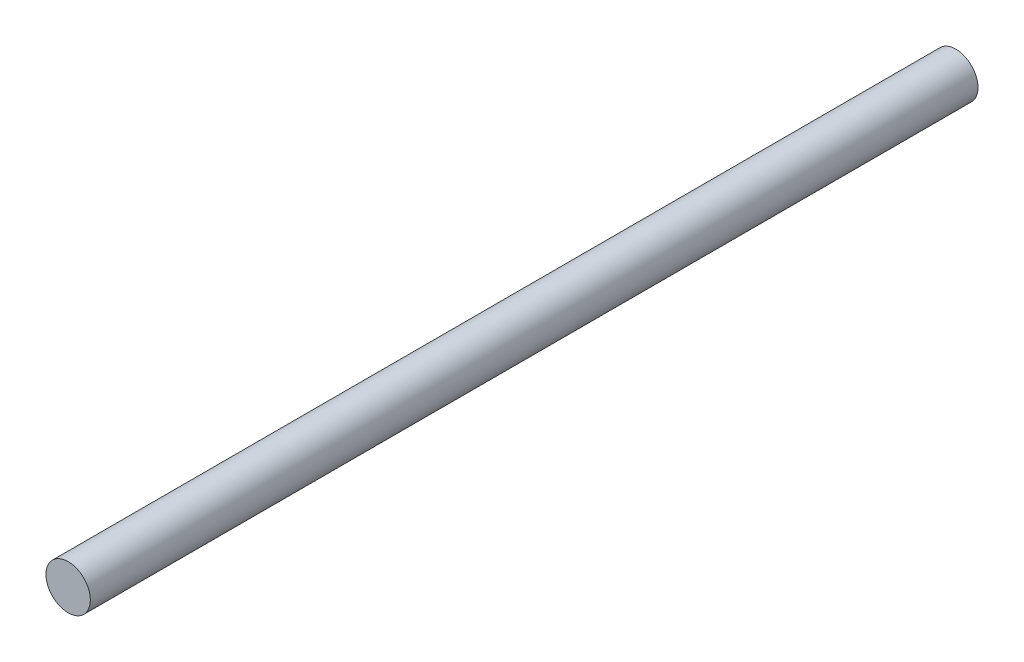
ISO-10303-21;
HEADER;
FILE_DESCRIPTION(('STEP AP214'),'2;1');
FILE_NAME('part.step','',(''),(''),'','','');
FILE_SCHEMA(('AUTOMOTIVE_DESIGN { 1 0 10303 214 1 1 1 1 }'));
ENDSEC;
DATA;
#1=APPLICATION_CONTEXT('core data for automotive mechanical design processes');
#2=APPLICATION_PROTOCOL_DEFINITION('international standard','automotive_design',2000,#1);
#3=PRODUCT_CONTEXT('',#1,'mechanical');
#4=PRODUCT('Part','Part','',(#3));
#5=PRODUCT_RELATED_PRODUCT_CATEGORY('part','',(#4));
#6=PRODUCT_DEFINITION_FORMATION('','',#4);
#7=PRODUCT_DEFINITION_CONTEXT('part definition',#1,'design');
#8=PRODUCT_DEFINITION('design','',#6,#7);
#9=PRODUCT_DEFINITION_SHAPE('','',#8);
#10=(LENGTH_UNIT() NAMED_UNIT(*) SI_UNIT(.MILLI.,.METRE.));
#11=(NAMED_UNIT(*) PLANE_ANGLE_UNIT() SI_UNIT($,.RADIAN.));
#12=(NAMED_UNIT(*) SI_UNIT($,.STERADIAN.) SOLID_ANGLE_UNIT());
#13=UNCERTAINTY_MEASURE_WITH_UNIT(LENGTH_MEASURE(1.E-05),#10,'distance_accuracy_value','');
#14=(GEOMETRIC_REPRESENTATION_CONTEXT(3) GLOBAL_UNCERTAINTY_ASSIGNED_CONTEXT((#13)) GLOBAL_UNIT_ASSIGNED_CONTEXT((#10,
#11,#12)) REPRESENTATION_CONTEXT('',''));
#15=CARTESIAN_POINT('',(0.,0.,0.));
#16=DIRECTION('',(0.,0.,1.));
#17=DIRECTION('',(1.,0.,0.));
#18=AXIS2_PLACEMENT_3D('',#15,#16,#17);
#19=CARTESIAN_POINT('',(0.,0.,-127.));
#20=DIRECTION('',(0.,0.,1.));
#21=DIRECTION('',(1.,0.,0.));
#22=AXIS2_PLACEMENT_3D('',#19,#20,#21);
#23=CYLINDRICAL_SURFACE('',#22,3.175);
#24=CARTESIAN_POINT('',(0.,0.,-127.));
#25=DIRECTION('',(0.,0.,1.));
#26=DIRECTION('',(1.,0.,0.));
#27=AXIS2_PLACEMENT_3D('',#24,#25,#26);
#28=CIRCLE('',#27,3.175);
#29=CARTESIAN_POINT('',(3.175,0.,-127.));
#30=VERTEX_POINT('',#29);
#31=EDGE_CURVE('E10',#30,#30,#28,.T.);
#32=ORIENTED_EDGE('',*,*,#31,.T.);
#33=EDGE_LOOP('',(#32));
#34=FACE_BOUND('',#33,.T.);
#35=CARTESIAN_POINT('',(0.,0.,0.));
#36=DIRECTION('',(0.,0.,1.));
#37=DIRECTION('',(1.,0.,0.));
#38=AXIS2_PLACEMENT_3D('',#35,#36,#37);
#39=CIRCLE('',#38,3.175);
#40=CARTESIAN_POINT('',(3.175,0.,0.));
#41=VERTEX_POINT('',#40);
#42=EDGE_CURVE('E34',#41,#41,#39,.T.);
#43=ORIENTED_EDGE('',*,*,#42,.F.);
#44=EDGE_LOOP('',(#43));
#45=FACE_BOUND('',#44,.T.);
#46=ADVANCED_FACE('F31',(#34,#45),#23,.T.);
#47=CARTESIAN_POINT('',(0.,0.,-127.));
#48=DIRECTION('',(0.,0.,1.));
#49=DIRECTION('',(1.,0.,0.));
#50=AXIS2_PLACEMENT_3D('',#47,#48,#49);
#51=PLANE('',#50);
#52=ORIENTED_EDGE('',*,*,#31,.F.);
#53=EDGE_LOOP('',(#52));
#54=FACE_BOUND('',#53,.T.);
#55=ADVANCED_FACE('F46',(#54),#51,.F.);
#56=CARTESIAN_POINT('',(0.,0.,0.));
#57=DIRECTION('',(0.,0.,1.));
#58=DIRECTION('',(1.,0.,0.));
#59=AXIS2_PLACEMENT_3D('',#56,#57,#58);
#60=PLANE('',#59);
#61=ORIENTED_EDGE('',*,*,#42,.T.);
#62=EDGE_LOOP('',(#61));
#63=FACE_BOUND('',#62,.T.);
#64=ADVANCED_FACE('F43',(#63),#60,.T.);
#65=CLOSED_SHELL('',(#46,#55,#64));
#66=MANIFOLD_SOLID_BREP('B2',#65);
#67=ADVANCED_BREP_SHAPE_REPRESENTATION('',(#18,#66),#14);
#68=SHAPE_DEFINITION_REPRESENTATION(#9,#67);
ENDSEC;
END-ISO-10303-21;
